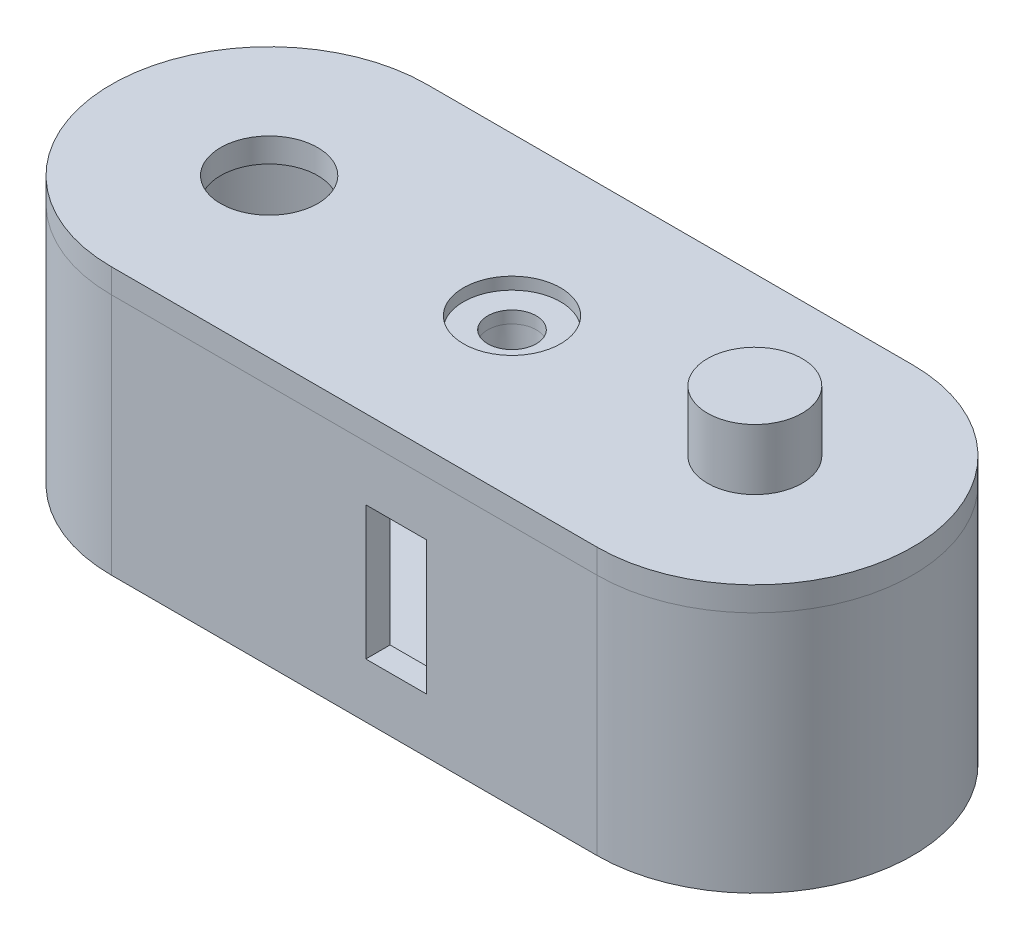
ISO-10303-21;
HEADER;
FILE_DESCRIPTION(('STEP AP214'),'2;1');
FILE_NAME('part.step','',(''),(''),'','','');
FILE_SCHEMA(('AUTOMOTIVE_DESIGN { 1 0 10303 214 1 1 1 1 }'));
ENDSEC;
DATA;
#1=APPLICATION_CONTEXT('core data for automotive mechanical design processes');
#2=APPLICATION_PROTOCOL_DEFINITION('international standard','automotive_design',2000,#1);
#3=PRODUCT_CONTEXT('',#1,'mechanical');
#4=PRODUCT('Part','Part','',(#3));
#5=PRODUCT_RELATED_PRODUCT_CATEGORY('part','',(#4));
#6=PRODUCT_DEFINITION_FORMATION('','',#4);
#7=PRODUCT_DEFINITION_CONTEXT('part definition',#1,'design');
#8=PRODUCT_DEFINITION('design','',#6,#7);
#9=PRODUCT_DEFINITION_SHAPE('','',#8);
#10=(LENGTH_UNIT() NAMED_UNIT(*) SI_UNIT(.MILLI.,.METRE.));
#11=(NAMED_UNIT(*) PLANE_ANGLE_UNIT() SI_UNIT($,.RADIAN.));
#12=(NAMED_UNIT(*) SI_UNIT($,.STERADIAN.) SOLID_ANGLE_UNIT());
#13=UNCERTAINTY_MEASURE_WITH_UNIT(LENGTH_MEASURE(1.E-05),#10,'distance_accuracy_value','');
#14=(GEOMETRIC_REPRESENTATION_CONTEXT(3) GLOBAL_UNCERTAINTY_ASSIGNED_CONTEXT((#13)) GLOBAL_UNIT_ASSIGNED_CONTEXT((#10,
#11,#12)) REPRESENTATION_CONTEXT('',''));
#15=CARTESIAN_POINT('',(0.,0.,0.));
#16=DIRECTION('',(0.,0.,1.));
#17=DIRECTION('',(1.,0.,0.));
#18=AXIS2_PLACEMENT_3D('',#15,#16,#17);
#19=CARTESIAN_POINT('',(20.,20.,0.));
#20=DIRECTION('',(0.,1.,0.));
#21=DIRECTION('',(0.,0.,1.));
#22=AXIS2_PLACEMENT_3D('',#19,#20,#21);
#23=CYLINDRICAL_SURFACE('',#22,2.);
#24=CARTESIAN_POINT('',(20.,20.,0.));
#25=DIRECTION('',(0.,1.,0.));
#26=DIRECTION('',(0.,0.,1.));
#27=AXIS2_PLACEMENT_3D('',#24,#25,#26);
#28=CIRCLE('',#27,2.);
#29=CARTESIAN_POINT('',(20.,20.,2.));
#30=VERTEX_POINT('',#29);
#31=EDGE_CURVE('E127',#30,#30,#28,.T.);
#32=ORIENTED_EDGE('',*,*,#31,.F.);
#33=EDGE_LOOP('',(#32));
#34=FACE_BOUND('',#33,.T.);
#35=CARTESIAN_POINT('',(20.,21.,0.));
#36=DIRECTION('',(0.,1.,0.));
#37=DIRECTION('',(0.,0.,1.));
#38=AXIS2_PLACEMENT_3D('',#35,#36,#37);
#39=CIRCLE('',#38,2.);
#40=CARTESIAN_POINT('',(20.,21.,2.));
#41=VERTEX_POINT('',#40);
#42=EDGE_CURVE('E125',#41,#41,#39,.F.);
#43=ORIENTED_EDGE('',*,*,#42,.F.);
#44=EDGE_LOOP('',(#43));
#45=FACE_BOUND('',#44,.T.);
#46=ADVANCED_FACE('F46',(#34,#45),#23,.F.);
#47=CARTESIAN_POINT('',(0.,22.,0.));
#48=DIRECTION('',(0.,1.,0.));
#49=DIRECTION('',(0.,0.,1.));
#50=AXIS2_PLACEMENT_3D('',#47,#48,#49);
#51=PLANE('',#50);
#52=CARTESIAN_POINT('',(40.0000000000001,22.,0.));
#53=DIRECTION('',(0.,1.,0.));
#54=DIRECTION('',(0.,0.,1.));
#55=AXIS2_PLACEMENT_3D('',#52,#53,#54);
#56=CIRCLE('',#55,3.9);
#57=CARTESIAN_POINT('',(40.0000000000001,22.,3.90000000000009));
#58=VERTEX_POINT('',#57);
#59=EDGE_CURVE('E164',#58,#58,#56,.T.);
#60=ORIENTED_EDGE('',*,*,#59,.F.);
#61=EDGE_LOOP('',(#60));
#62=FACE_BOUND('',#61,.T.);
#63=CARTESIAN_POINT('',(20.,22.,0.));
#64=DIRECTION('',(0.,1.,0.));
#65=DIRECTION('',(0.,0.,1.));
#66=AXIS2_PLACEMENT_3D('',#63,#64,#65);
#67=CIRCLE('',#66,4.);
#68=CARTESIAN_POINT('',(20.,22.,4.));
#69=VERTEX_POINT('',#68);
#70=EDGE_CURVE('E152',#69,#69,#67,.T.);
#71=ORIENTED_EDGE('',*,*,#70,.F.);
#72=EDGE_LOOP('',(#71));
#73=FACE_BOUND('',#72,.T.);
#74=CARTESIAN_POINT('',(0.,22.,0.));
#75=DIRECTION('',(0.,1.,0.));
#76=DIRECTION('',(0.,0.,1.));
#77=AXIS2_PLACEMENT_3D('',#74,#75,#76);
#78=CIRCLE('',#77,12.9999999999999);
#79=CARTESIAN_POINT('',(0.,22.,-12.9999999999999));
#80=VERTEX_POINT('',#79);
#81=CARTESIAN_POINT('',(0.,22.,12.9999999999999));
#82=VERTEX_POINT('',#81);
#83=EDGE_CURVE('E100',#80,#82,#78,.T.);
#84=ORIENTED_EDGE('',*,*,#83,.T.);
#85=DIRECTION('',(1.,0.,0.));
#86=VECTOR('',#85,1.);
#87=CARTESIAN_POINT('',(0.,22.,12.9999999999999));
#88=LINE('',#87,#86);
#89=CARTESIAN_POINT('',(40.0000000000001,22.,13.));
#90=VERTEX_POINT('',#89);
#91=EDGE_CURVE('E94',#82,#90,#88,.T.);
#92=ORIENTED_EDGE('',*,*,#91,.T.);
#93=CARTESIAN_POINT('',(40.0000000000001,22.,0.));
#94=DIRECTION('',(0.,1.,0.));
#95=DIRECTION('',(0.,0.,1.));
#96=AXIS2_PLACEMENT_3D('',#93,#94,#95);
#97=CIRCLE('',#96,12.9999999999999);
#98=CARTESIAN_POINT('',(40.0000000000001,22.,-12.9999999999999));
#99=VERTEX_POINT('',#98);
#100=EDGE_CURVE('E98',#90,#99,#97,.T.);
#101=ORIENTED_EDGE('',*,*,#100,.T.);
#102=DIRECTION('',(-1.,0.,0.));
#103=VECTOR('',#102,1.);
#104=CARTESIAN_POINT('',(0.,22.,-12.9999999999999));
#105=LINE('',#104,#103);
#106=EDGE_CURVE('E63',#99,#80,#105,.T.);
#107=ORIENTED_EDGE('',*,*,#106,.T.);
#108=EDGE_LOOP('',(#84,#92,#101,#107));
#109=FACE_BOUND('',#108,.T.);
#110=CARTESIAN_POINT('',(0.,22.,0.));
#111=DIRECTION('',(0.,1.,0.));
#112=DIRECTION('',(0.,0.,1.));
#113=AXIS2_PLACEMENT_3D('',#110,#111,#112);
#114=CIRCLE('',#113,4.);
#115=CARTESIAN_POINT('',(0.,22.,4.));
#116=VERTEX_POINT('',#115);
#117=EDGE_CURVE('E118',#116,#116,#114,.T.);
#118=ORIENTED_EDGE('',*,*,#117,.F.);
#119=EDGE_LOOP('',(#118));
#120=FACE_BOUND('',#119,.T.);
#121=ADVANCED_FACE('F95',(#62,#73,#109,#120),#51,.T.);
#122=CARTESIAN_POINT('',(0.,20.,0.));
#123=DIRECTION('',(0.,1.,0.));
#124=DIRECTION('',(0.,0.,1.));
#125=AXIS2_PLACEMENT_3D('',#122,#123,#124);
#126=PLANE('',#125);
#127=CARTESIAN_POINT('',(40.0000000000001,20.,0.));
#128=DIRECTION('',(0.,1.,0.));
#129=DIRECTION('',(0.,0.,1.));
#130=AXIS2_PLACEMENT_3D('',#127,#128,#129);
#131=CIRCLE('',#130,10.1725500130529);
#132=CARTESIAN_POINT('',(40.0000000000001,20.,10.1725500130529));
#133=VERTEX_POINT('',#132);
#134=EDGE_CURVE('E55',#133,#133,#131,.F.);
#135=ORIENTED_EDGE('',*,*,#134,.F.);
#136=EDGE_LOOP('',(#135));
#137=FACE_BOUND('',#136,.T.);
#138=ORIENTED_EDGE('',*,*,#31,.T.);
#139=EDGE_LOOP('',(#138));
#140=FACE_BOUND('',#139,.T.);
#141=CARTESIAN_POINT('',(0.,20.,0.));
#142=DIRECTION('',(0.,1.,0.));
#143=DIRECTION('',(0.,0.,1.));
#144=AXIS2_PLACEMENT_3D('',#141,#142,#143);
#145=CIRCLE('',#144,12.9999999999999);
#146=CARTESIAN_POINT('',(0.,20.,-12.9999999999999));
#147=VERTEX_POINT('',#146);
#148=CARTESIAN_POINT('',(0.,20.,12.9999999999999));
#149=VERTEX_POINT('',#148);
#150=EDGE_CURVE('E115',#147,#149,#145,.T.);
#151=ORIENTED_EDGE('',*,*,#150,.F.);
#152=DIRECTION('',(-1.,0.,0.));
#153=VECTOR('',#152,1.);
#154=CARTESIAN_POINT('',(0.,20.,-12.9999999999999));
#155=LINE('',#154,#153);
#156=CARTESIAN_POINT('',(40.0000000000001,20.,-12.9999999999999));
#157=VERTEX_POINT('',#156);
#158=EDGE_CURVE('E86',#157,#147,#155,.T.);
#159=ORIENTED_EDGE('',*,*,#158,.F.);
#160=CARTESIAN_POINT('',(40.0000000000001,20.,0.));
#161=DIRECTION('',(0.,1.,0.));
#162=DIRECTION('',(0.,0.,1.));
#163=AXIS2_PLACEMENT_3D('',#160,#161,#162);
#164=CIRCLE('',#163,12.9999999999999);
#165=CARTESIAN_POINT('',(40.0000000000001,20.,13.));
#166=VERTEX_POINT('',#165);
#167=EDGE_CURVE('E80',#166,#157,#164,.T.);
#168=ORIENTED_EDGE('',*,*,#167,.F.);
#169=DIRECTION('',(1.,0.,0.));
#170=VECTOR('',#169,1.);
#171=CARTESIAN_POINT('',(0.,20.,12.9999999999999));
#172=LINE('',#171,#170);
#173=EDGE_CURVE('E105',#149,#166,#172,.T.);
#174=ORIENTED_EDGE('',*,*,#173,.F.);
#175=EDGE_LOOP('',(#151,#159,#168,#174));
#176=FACE_BOUND('',#175,.T.);
#177=CARTESIAN_POINT('',(0.,20.,0.));
#178=DIRECTION('',(0.,1.,0.));
#179=DIRECTION('',(0.,0.,1.));
#180=AXIS2_PLACEMENT_3D('',#177,#178,#179);
#181=CIRCLE('',#180,4.);
#182=CARTESIAN_POINT('',(0.,20.,4.));
#183=VERTEX_POINT('',#182);
#184=EDGE_CURVE('E145',#183,#183,#181,.T.);
#185=ORIENTED_EDGE('',*,*,#184,.T.);
#186=EDGE_LOOP('',(#185));
#187=FACE_BOUND('',#186,.T.);
#188=ADVANCED_FACE('F134',(#137,#140,#176,#187),#126,.F.);
#189=CARTESIAN_POINT('',(0.,22.,0.));
#190=DIRECTION('',(0.,-1.,0.));
#191=DIRECTION('',(0.,0.,-1.));
#192=AXIS2_PLACEMENT_3D('',#189,#190,#191);
#193=CYLINDRICAL_SURFACE('',#192,12.9999999999999);
#194=ORIENTED_EDGE('',*,*,#150,.T.);
#195=DIRECTION('',(0.,-1.,0.));
#196=VECTOR('',#195,1.);
#197=CARTESIAN_POINT('',(0.,22.,12.9999999999999));
#198=LINE('',#197,#196);
#199=EDGE_CURVE('E106',#82,#149,#198,.T.);
#200=ORIENTED_EDGE('',*,*,#199,.F.);
#201=ORIENTED_EDGE('',*,*,#83,.F.);
#202=DIRECTION('',(0.,-1.,0.));
#203=VECTOR('',#202,1.);
#204=CARTESIAN_POINT('',(0.,22.,-12.9999999999999));
#205=LINE('',#204,#203);
#206=EDGE_CURVE('E111',#80,#147,#205,.T.);
#207=ORIENTED_EDGE('',*,*,#206,.T.);
#208=EDGE_LOOP('',(#194,#200,#201,#207));
#209=FACE_BOUND('',#208,.T.);
#210=ADVANCED_FACE('F48',(#209),#193,.T.);
#211=CARTESIAN_POINT('',(0.,22.,12.9999999999999));
#212=DIRECTION('',(0.,0.,-1.));
#213=DIRECTION('',(-1.,0.,0.));
#214=AXIS2_PLACEMENT_3D('',#211,#212,#213);
#215=PLANE('',#214);
#216=ORIENTED_EDGE('',*,*,#173,.T.);
#217=DIRECTION('',(0.,-1.,0.));
#218=VECTOR('',#217,1.);
#219=CARTESIAN_POINT('',(40.0000000000001,22.,13.));
#220=LINE('',#219,#218);
#221=EDGE_CURVE('E103',#90,#166,#220,.T.);
#222=ORIENTED_EDGE('',*,*,#221,.F.);
#223=ORIENTED_EDGE('',*,*,#91,.F.);
#224=ORIENTED_EDGE('',*,*,#199,.T.);
#225=EDGE_LOOP('',(#216,#222,#223,#224));
#226=FACE_BOUND('',#225,.T.);
#227=ADVANCED_FACE('F104',(#226),#215,.F.);
#228=CARTESIAN_POINT('',(40.0000000000001,22.,0.));
#229=DIRECTION('',(0.,-1.,0.));
#230=DIRECTION('',(0.,0.,-1.));
#231=AXIS2_PLACEMENT_3D('',#228,#229,#230);
#232=CYLINDRICAL_SURFACE('',#231,12.9999999999999);
#233=ORIENTED_EDGE('',*,*,#167,.T.);
#234=DIRECTION('',(0.,-1.,0.));
#235=VECTOR('',#234,1.);
#236=CARTESIAN_POINT('',(40.0000000000001,22.,-12.9999999999999));
#237=LINE('',#236,#235);
#238=EDGE_CURVE('E107',#99,#157,#237,.T.);
#239=ORIENTED_EDGE('',*,*,#238,.F.);
#240=ORIENTED_EDGE('',*,*,#100,.F.);
#241=ORIENTED_EDGE('',*,*,#221,.T.);
#242=EDGE_LOOP('',(#233,#239,#240,#241));
#243=FACE_BOUND('',#242,.T.);
#244=ADVANCED_FACE('F109',(#243),#232,.T.);
#245=CARTESIAN_POINT('',(0.,22.,-12.9999999999999));
#246=DIRECTION('',(0.,0.,1.));
#247=DIRECTION('',(1.,0.,0.));
#248=AXIS2_PLACEMENT_3D('',#245,#246,#247);
#249=PLANE('',#248);
#250=ORIENTED_EDGE('',*,*,#158,.T.);
#251=ORIENTED_EDGE('',*,*,#206,.F.);
#252=ORIENTED_EDGE('',*,*,#106,.F.);
#253=ORIENTED_EDGE('',*,*,#238,.T.);
#254=EDGE_LOOP('',(#250,#251,#252,#253));
#255=FACE_BOUND('',#254,.T.);
#256=ADVANCED_FACE('F208',(#255),#249,.F.);
#257=CARTESIAN_POINT('',(0.,22.,0.));
#258=DIRECTION('',(0.,-1.,0.));
#259=DIRECTION('',(0.,0.,-1.));
#260=AXIS2_PLACEMENT_3D('',#257,#258,#259);
#261=CYLINDRICAL_SURFACE('',#260,4.);
#262=ORIENTED_EDGE('',*,*,#117,.T.);
#263=EDGE_LOOP('',(#262));
#264=FACE_BOUND('',#263,.T.);
#265=ORIENTED_EDGE('',*,*,#184,.F.);
#266=EDGE_LOOP('',(#265));
#267=FACE_BOUND('',#266,.T.);
#268=ADVANCED_FACE('F196',(#264,#267),#261,.F.);
#269=CARTESIAN_POINT('',(20.,21.,0.));
#270=DIRECTION('',(0.,1.,0.));
#271=DIRECTION('',(0.,0.,1.));
#272=AXIS2_PLACEMENT_3D('',#269,#270,#271);
#273=PLANE('',#272);
#274=CARTESIAN_POINT('',(20.,21.,0.));
#275=DIRECTION('',(0.,1.,0.));
#276=DIRECTION('',(0.,0.,1.));
#277=AXIS2_PLACEMENT_3D('',#274,#275,#276);
#278=CIRCLE('',#277,4.);
#279=CARTESIAN_POINT('',(20.,21.,4.));
#280=VERTEX_POINT('',#279);
#281=EDGE_CURVE('E128',#280,#280,#278,.T.);
#282=ORIENTED_EDGE('',*,*,#281,.T.);
#283=EDGE_LOOP('',(#282));
#284=FACE_BOUND('',#283,.T.);
#285=ORIENTED_EDGE('',*,*,#42,.T.);
#286=EDGE_LOOP('',(#285));
#287=FACE_BOUND('',#286,.T.);
#288=ADVANCED_FACE('F187',(#284,#287),#273,.T.);
#289=CARTESIAN_POINT('',(20.,21.,0.));
#290=DIRECTION('',(0.,1.,0.));
#291=DIRECTION('',(0.,0.,1.));
#292=AXIS2_PLACEMENT_3D('',#289,#290,#291);
#293=CYLINDRICAL_SURFACE('',#292,4.);
#294=ORIENTED_EDGE('',*,*,#281,.F.);
#295=EDGE_LOOP('',(#294));
#296=FACE_BOUND('',#295,.T.);
#297=ORIENTED_EDGE('',*,*,#70,.T.);
#298=EDGE_LOOP('',(#297));
#299=FACE_BOUND('',#298,.T.);
#300=ADVANCED_FACE('F184',(#296,#299),#293,.F.);
#301=CARTESIAN_POINT('',(40.0000000000001,13.,0.));
#302=DIRECTION('',(0.,-1.,0.));
#303=DIRECTION('',(0.,0.,-1.));
#304=AXIS2_PLACEMENT_3D('',#301,#302,#303);
#305=PLANE('',#304);
#306=CARTESIAN_POINT('',(40.0000000000001,13.,0.));
#307=DIRECTION('',(0.,-1.,0.));
#308=DIRECTION('',(0.,0.,-1.));
#309=AXIS2_PLACEMENT_3D('',#306,#307,#308);
#310=CIRCLE('',#309,10.1725500130529);
#311=CARTESIAN_POINT('',(40.0000000000001,13.,-10.1725500130528));
#312=VERTEX_POINT('',#311);
#313=EDGE_CURVE('E155',#312,#312,#310,.T.);
#314=ORIENTED_EDGE('',*,*,#313,.T.);
#315=EDGE_LOOP('',(#314));
#316=FACE_BOUND('',#315,.T.);
#317=CARTESIAN_POINT('',(40.0000000000001,13.,0.));
#318=DIRECTION('',(0.,-1.,0.));
#319=DIRECTION('',(0.,0.,-1.));
#320=AXIS2_PLACEMENT_3D('',#317,#318,#319);
#321=CIRCLE('',#320,8.79078221641569);
#322=CARTESIAN_POINT('',(40.0000000000001,13.,-8.7907822164156));
#323=VERTEX_POINT('',#322);
#324=EDGE_CURVE('E160',#323,#323,#321,.T.);
#325=ORIENTED_EDGE('',*,*,#324,.F.);
#326=EDGE_LOOP('',(#325));
#327=FACE_BOUND('',#326,.T.);
#328=ADVANCED_FACE('F186',(#316,#327),#305,.T.);
#329=CARTESIAN_POINT('',(40.0000000000001,13.,0.));
#330=DIRECTION('',(0.,1.,0.));
#331=DIRECTION('',(0.,0.,1.));
#332=AXIS2_PLACEMENT_3D('',#329,#330,#331);
#333=CYLINDRICAL_SURFACE('',#332,10.1725500130529);
#334=ORIENTED_EDGE('',*,*,#313,.F.);
#335=EDGE_LOOP('',(#334));
#336=FACE_BOUND('',#335,.T.);
#337=ORIENTED_EDGE('',*,*,#134,.T.);
#338=EDGE_LOOP('',(#337));
#339=FACE_BOUND('',#338,.T.);
#340=ADVANCED_FACE('F132',(#336,#339),#333,.T.);
#341=CARTESIAN_POINT('',(40.0000000000001,13.,0.));
#342=DIRECTION('',(0.,1.,0.));
#343=DIRECTION('',(0.,0.,1.));
#344=AXIS2_PLACEMENT_3D('',#341,#342,#343);
#345=CYLINDRICAL_SURFACE('',#344,8.79078221641569);
#346=CARTESIAN_POINT('',(40.0000000000001,16.,0.));
#347=DIRECTION('',(0.,-1.,0.));
#348=DIRECTION('',(0.,0.,-1.));
#349=AXIS2_PLACEMENT_3D('',#346,#347,#348);
#350=CIRCLE('',#349,8.79078221641569);
#351=CARTESIAN_POINT('',(40.0000000000001,16.,-8.7907822164156));
#352=VERTEX_POINT('',#351);
#353=EDGE_CURVE('E12',#352,#352,#350,.T.);
#354=ORIENTED_EDGE('',*,*,#353,.F.);
#355=EDGE_LOOP('',(#354));
#356=FACE_BOUND('',#355,.T.);
#357=ORIENTED_EDGE('',*,*,#324,.T.);
#358=EDGE_LOOP('',(#357));
#359=FACE_BOUND('',#358,.T.);
#360=ADVANCED_FACE('F255',(#356,#359),#345,.F.);
#361=CARTESIAN_POINT('',(40.0000000000001,16.,0.));
#362=DIRECTION('',(0.,-1.,0.));
#363=DIRECTION('',(0.,0.,-1.));
#364=AXIS2_PLACEMENT_3D('',#361,#362,#363);
#365=PLANE('',#364);
#366=ORIENTED_EDGE('',*,*,#353,.T.);
#367=EDGE_LOOP('',(#366));
#368=FACE_BOUND('',#367,.T.);
#369=ADVANCED_FACE('F175',(#368),#365,.T.);
#370=CARTESIAN_POINT('',(40.0000000000001,27.,0.));
#371=DIRECTION('',(0.,-1.,0.));
#372=DIRECTION('',(0.,0.,-1.));
#373=AXIS2_PLACEMENT_3D('',#370,#371,#372);
#374=CYLINDRICAL_SURFACE('',#373,3.9);
#375=CARTESIAN_POINT('',(40.0000000000001,27.,0.));
#376=DIRECTION('',(0.,1.,0.));
#377=DIRECTION('',(0.,0.,1.));
#378=AXIS2_PLACEMENT_3D('',#375,#376,#377);
#379=CIRCLE('',#378,3.9);
#380=CARTESIAN_POINT('',(40.0000000000001,27.,3.90000000000009));
#381=VERTEX_POINT('',#380);
#382=EDGE_CURVE('E163',#381,#381,#379,.T.);
#383=ORIENTED_EDGE('',*,*,#382,.F.);
#384=EDGE_LOOP('',(#383));
#385=FACE_BOUND('',#384,.T.);
#386=ORIENTED_EDGE('',*,*,#59,.T.);
#387=EDGE_LOOP('',(#386));
#388=FACE_BOUND('',#387,.T.);
#389=ADVANCED_FACE('F172',(#385,#388),#374,.T.);
#390=CARTESIAN_POINT('',(40.0000000000001,27.,0.));
#391=DIRECTION('',(0.,1.,0.));
#392=DIRECTION('',(0.,0.,1.));
#393=AXIS2_PLACEMENT_3D('',#390,#391,#392);
#394=PLANE('',#393);
#395=ORIENTED_EDGE('',*,*,#382,.T.);
#396=EDGE_LOOP('',(#395));
#397=FACE_BOUND('',#396,.T.);
#398=ADVANCED_FACE('F170',(#397),#394,.T.);
#399=CLOSED_SHELL('',(#46,#121,#188,#210,#227,#244,#256,#268,#288,#300,#328,#340,#360,#369,#389,#398));
#400=MANIFOLD_SOLID_BREP('B2',#399);
#401=CARTESIAN_POINT('',(0.,20.,0.));
#402=DIRECTION('',(0.,-1.,0.));
#403=DIRECTION('',(0.,0.,-1.));
#404=AXIS2_PLACEMENT_3D('',#401,#402,#403);
#405=CYLINDRICAL_SURFACE('',#404,11.);
#406=CARTESIAN_POINT('',(0.,8.,0.));
#407=DIRECTION('',(0.,1.,0.));
#408=DIRECTION('',(0.,0.,1.));
#409=AXIS2_PLACEMENT_3D('',#406,#407,#408);
#410=CIRCLE('',#409,11.);
#411=CARTESIAN_POINT('',(0.,8.,-11.));
#412=VERTEX_POINT('',#411);
#413=CARTESIAN_POINT('',(0.,8.,11.));
#414=VERTEX_POINT('',#413);
#415=EDGE_CURVE('E541',#412,#414,#410,.T.);
#416=ORIENTED_EDGE('',*,*,#415,.F.);
#417=DIRECTION('',(0.,-1.,0.));
#418=VECTOR('',#417,1.);
#419=CARTESIAN_POINT('',(0.,20.,-11.));
#420=LINE('',#419,#418);
#421=CARTESIAN_POINT('',(0.,20.,-11.));
#422=VERTEX_POINT('',#421);
#423=EDGE_CURVE('E572',#422,#412,#420,.T.);
#424=ORIENTED_EDGE('',*,*,#423,.F.);
#425=CARTESIAN_POINT('',(0.,20.,0.));
#426=DIRECTION('',(0.,1.,0.));
#427=DIRECTION('',(0.,0.,1.));
#428=AXIS2_PLACEMENT_3D('',#425,#426,#427);
#429=CIRCLE('',#428,11.);
#430=CARTESIAN_POINT('',(0.,20.,11.));
#431=VERTEX_POINT('',#430);
#432=EDGE_CURVE('E563',#422,#431,#429,.T.);
#433=ORIENTED_EDGE('',*,*,#432,.T.);
#434=DIRECTION('',(0.,-1.,0.));
#435=VECTOR('',#434,1.);
#436=CARTESIAN_POINT('',(0.,20.,11.));
#437=LINE('',#436,#435);
#438=EDGE_CURVE('E581',#431,#414,#437,.T.);
#439=ORIENTED_EDGE('',*,*,#438,.T.);
#440=EDGE_LOOP('',(#416,#424,#433,#439));
#441=FACE_BOUND('',#440,.T.);
#442=ADVANCED_FACE('F331',(#441),#405,.F.);
#443=CARTESIAN_POINT('',(0.,20.,11.));
#444=DIRECTION('',(0.,0.,-1.));
#445=DIRECTION('',(-1.,0.,0.));
#446=AXIS2_PLACEMENT_3D('',#443,#444,#445);
#447=PLANE('',#446);
#448=DIRECTION('',(-1.,0.,0.));
#449=VECTOR('',#448,1.);
#450=CARTESIAN_POINT('',(25.95994674273,15.5,11.));
#451=LINE('',#450,#449);
#452=CARTESIAN_POINT('',(25.95994674273,15.5,11.));
#453=VERTEX_POINT('',#452);
#454=CARTESIAN_POINT('',(20.95994674273,15.5,11.));
#455=VERTEX_POINT('',#454);
#456=EDGE_CURVE('E487',#453,#455,#451,.T.);
#457=ORIENTED_EDGE('',*,*,#456,.T.);
#458=DIRECTION('',(0.,-1.,0.));
#459=VECTOR('',#458,1.);
#460=CARTESIAN_POINT('',(20.95994674273,15.5,11.));
#461=LINE('',#460,#459);
#462=CARTESIAN_POINT('',(20.95994674273,4.5,11.));
#463=VERTEX_POINT('',#462);
#464=EDGE_CURVE('E490',#455,#463,#461,.T.);
#465=ORIENTED_EDGE('',*,*,#464,.T.);
#466=DIRECTION('',(1.,0.,0.));
#467=VECTOR('',#466,1.);
#468=CARTESIAN_POINT('',(25.95994674273,4.5,11.));
#469=LINE('',#468,#467);
#470=CARTESIAN_POINT('',(25.95994674273,4.5,11.));
#471=VERTEX_POINT('',#470);
#472=EDGE_CURVE('E494',#463,#471,#469,.T.);
#473=ORIENTED_EDGE('',*,*,#472,.T.);
#474=DIRECTION('',(0.,1.,0.));
#475=VECTOR('',#474,1.);
#476=CARTESIAN_POINT('',(25.95994674273,15.5,11.));
#477=LINE('',#476,#475);
#478=EDGE_CURVE('E497',#471,#453,#477,.T.);
#479=ORIENTED_EDGE('',*,*,#478,.T.);
#480=EDGE_LOOP('',(#457,#465,#473,#479));
#481=FACE_BOUND('',#480,.T.);
#482=DIRECTION('',(0.,-1.,0.));
#483=VECTOR('',#482,1.);
#484=CARTESIAN_POINT('',(40.,20.,11.));
#485=LINE('',#484,#483);
#486=CARTESIAN_POINT('',(40.,20.,11.));
#487=VERTEX_POINT('',#486);
#488=CARTESIAN_POINT('',(40.0000000000001,4.,11.));
#489=VERTEX_POINT('',#488);
#490=EDGE_CURVE('E578',#487,#489,#485,.T.);
#491=ORIENTED_EDGE('',*,*,#490,.T.);
#492=DIRECTION('',(-1.,0.,0.));
#493=VECTOR('',#492,1.);
#494=CARTESIAN_POINT('',(20.,4.,11.));
#495=LINE('',#494,#493);
#496=CARTESIAN_POINT('',(0.,4.,11.));
#497=VERTEX_POINT('',#496);
#498=EDGE_CURVE('E557',#489,#497,#495,.T.);
#499=ORIENTED_EDGE('',*,*,#498,.T.);
#500=DIRECTION('',(0.,-1.,0.));
#501=VECTOR('',#500,1.);
#502=CARTESIAN_POINT('',(0.,8.,11.));
#503=LINE('',#502,#501);
#504=EDGE_CURVE('E546',#497,#414,#503,.F.);
#505=ORIENTED_EDGE('',*,*,#504,.T.);
#506=ORIENTED_EDGE('',*,*,#438,.F.);
#507=DIRECTION('',(1.,0.,0.));
#508=VECTOR('',#507,1.);
#509=CARTESIAN_POINT('',(0.,20.,11.));
#510=LINE('',#509,#508);
#511=EDGE_CURVE('E565',#431,#487,#510,.T.);
#512=ORIENTED_EDGE('',*,*,#511,.T.);
#513=EDGE_LOOP('',(#491,#499,#505,#506,#512));
#514=FACE_BOUND('',#513,.T.);
#515=ADVANCED_FACE('F652',(#481,#514),#447,.T.);
#516=CARTESIAN_POINT('',(40.,20.,0.));
#517=DIRECTION('',(0.,-1.,0.));
#518=DIRECTION('',(0.,0.,-1.));
#519=AXIS2_PLACEMENT_3D('',#516,#517,#518);
#520=CYLINDRICAL_SURFACE('',#519,11.);
#521=DIRECTION('',(0.,-1.,0.));
#522=VECTOR('',#521,1.);
#523=CARTESIAN_POINT('',(40.,20.,-11.));
#524=LINE('',#523,#522);
#525=CARTESIAN_POINT('',(40.,20.,-11.));
#526=VERTEX_POINT('',#525);
#527=CARTESIAN_POINT('',(40.,4.,-11.));
#528=VERTEX_POINT('',#527);
#529=EDGE_CURVE('E575',#526,#528,#524,.T.);
#530=ORIENTED_EDGE('',*,*,#529,.T.);
#531=CARTESIAN_POINT('',(40.0000000000001,4.,0.));
#532=DIRECTION('',(0.,-1.,0.));
#533=DIRECTION('',(0.,0.,-1.));
#534=AXIS2_PLACEMENT_3D('',#531,#532,#533);
#535=CIRCLE('',#534,11.);
#536=EDGE_CURVE('E552',#528,#489,#535,.T.);
#537=ORIENTED_EDGE('',*,*,#536,.T.);
#538=ORIENTED_EDGE('',*,*,#490,.F.);
#539=CARTESIAN_POINT('',(40.,20.,0.));
#540=DIRECTION('',(0.,1.,0.));
#541=DIRECTION('',(0.,0.,1.));
#542=AXIS2_PLACEMENT_3D('',#539,#540,#541);
#543=CIRCLE('',#542,11.);
#544=EDGE_CURVE('E567',#487,#526,#543,.T.);
#545=ORIENTED_EDGE('',*,*,#544,.T.);
#546=EDGE_LOOP('',(#530,#537,#538,#545));
#547=FACE_BOUND('',#546,.T.);
#548=ADVANCED_FACE('F658',(#547),#520,.F.);
#549=CARTESIAN_POINT('',(0.,20.,-11.));
#550=DIRECTION('',(0.,0.,1.));
#551=DIRECTION('',(1.,0.,0.));
#552=AXIS2_PLACEMENT_3D('',#549,#550,#551);
#553=PLANE('',#552);
#554=DIRECTION('',(0.,-1.,0.));
#555=VECTOR('',#554,1.);
#556=CARTESIAN_POINT('',(25.95994674273,15.5,-11.));
#557=LINE('',#556,#555);
#558=CARTESIAN_POINT('',(25.95994674273,15.5,-11.));
#559=VERTEX_POINT('',#558);
#560=CARTESIAN_POINT('',(25.95994674273,4.5,-11.));
#561=VERTEX_POINT('',#560);
#562=EDGE_CURVE('E452',#559,#561,#557,.T.);
#563=ORIENTED_EDGE('',*,*,#562,.T.);
#564=DIRECTION('',(-1.,0.,0.));
#565=VECTOR('',#564,1.);
#566=CARTESIAN_POINT('',(25.95994674273,4.5,-11.));
#567=LINE('',#566,#565);
#568=CARTESIAN_POINT('',(20.95994674273,4.5,-11.));
#569=VERTEX_POINT('',#568);
#570=EDGE_CURVE('E461',#561,#569,#567,.T.);
#571=ORIENTED_EDGE('',*,*,#570,.T.);
#572=DIRECTION('',(0.,1.,0.));
#573=VECTOR('',#572,1.);
#574=CARTESIAN_POINT('',(20.95994674273,15.5,-11.));
#575=LINE('',#574,#573);
#576=CARTESIAN_POINT('',(20.95994674273,15.5,-11.));
#577=VERTEX_POINT('',#576);
#578=EDGE_CURVE('E346',#569,#577,#575,.T.);
#579=ORIENTED_EDGE('',*,*,#578,.T.);
#580=DIRECTION('',(1.,0.,0.));
#581=VECTOR('',#580,1.);
#582=CARTESIAN_POINT('',(25.95994674273,15.5,-11.));
#583=LINE('',#582,#581);
#584=EDGE_CURVE('E458',#577,#559,#583,.T.);
#585=ORIENTED_EDGE('',*,*,#584,.T.);
#586=EDGE_LOOP('',(#563,#571,#579,#585));
#587=FACE_BOUND('',#586,.T.);
#588=ORIENTED_EDGE('',*,*,#423,.T.);
#589=DIRECTION('',(0.,-1.,0.));
#590=VECTOR('',#589,1.);
#591=CARTESIAN_POINT('',(0.,8.,-11.));
#592=LINE('',#591,#590);
#593=CARTESIAN_POINT('',(0.,4.,-11.));
#594=VERTEX_POINT('',#593);
#595=EDGE_CURVE('E540',#594,#412,#592,.F.);
#596=ORIENTED_EDGE('',*,*,#595,.F.);
#597=DIRECTION('',(1.,0.,0.));
#598=VECTOR('',#597,1.);
#599=CARTESIAN_POINT('',(20.,4.,-11.));
#600=LINE('',#599,#598);
#601=EDGE_CURVE('E560',#594,#528,#600,.T.);
#602=ORIENTED_EDGE('',*,*,#601,.T.);
#603=ORIENTED_EDGE('',*,*,#529,.F.);
#604=DIRECTION('',(-1.,0.,0.));
#605=VECTOR('',#604,1.);
#606=CARTESIAN_POINT('',(0.,20.,-11.));
#607=LINE('',#606,#605);
#608=EDGE_CURVE('E570',#526,#422,#607,.T.);
#609=ORIENTED_EDGE('',*,*,#608,.T.);
#610=EDGE_LOOP('',(#588,#596,#602,#603,#609));
#611=FACE_BOUND('',#610,.T.);
#612=ADVANCED_FACE('F465',(#587,#611),#553,.T.);
#613=CARTESIAN_POINT('',(0.,20.,0.));
#614=DIRECTION('',(0.,1.,0.));
#615=DIRECTION('',(0.,0.,1.));
#616=AXIS2_PLACEMENT_3D('',#613,#614,#615);
#617=PLANE('',#616);
#618=CARTESIAN_POINT('',(0.,20.,0.));
#619=DIRECTION('',(0.,1.,0.));
#620=DIRECTION('',(0.,0.,1.));
#621=AXIS2_PLACEMENT_3D('',#618,#619,#620);
#622=CIRCLE('',#621,13.);
#623=CARTESIAN_POINT('',(0.,20.,-13.));
#624=VERTEX_POINT('',#623);
#625=CARTESIAN_POINT('',(0.,20.,13.));
#626=VERTEX_POINT('',#625);
#627=EDGE_CURVE('E585',#624,#626,#622,.T.);
#628=ORIENTED_EDGE('',*,*,#627,.T.);
#629=DIRECTION('',(1.,0.,0.));
#630=VECTOR('',#629,1.);
#631=CARTESIAN_POINT('',(0.,20.,13.));
#632=LINE('',#631,#630);
#633=CARTESIAN_POINT('',(40.,20.,13.));
#634=VERTEX_POINT('',#633);
#635=EDGE_CURVE('E588',#626,#634,#632,.T.);
#636=ORIENTED_EDGE('',*,*,#635,.T.);
#637=CARTESIAN_POINT('',(40.,20.,0.));
#638=DIRECTION('',(0.,1.,0.));
#639=DIRECTION('',(0.,0.,1.));
#640=AXIS2_PLACEMENT_3D('',#637,#638,#639);
#641=CIRCLE('',#640,13.);
#642=CARTESIAN_POINT('',(40.,20.,-13.));
#643=VERTEX_POINT('',#642);
#644=EDGE_CURVE('E591',#634,#643,#641,.T.);
#645=ORIENTED_EDGE('',*,*,#644,.T.);
#646=DIRECTION('',(-1.,0.,0.));
#647=VECTOR('',#646,1.);
#648=CARTESIAN_POINT('',(0.,20.,-13.));
#649=LINE('',#648,#647);
#650=EDGE_CURVE('E593',#643,#624,#649,.T.);
#651=ORIENTED_EDGE('',*,*,#650,.T.);
#652=EDGE_LOOP('',(#628,#636,#645,#651));
#653=FACE_BOUND('',#652,.T.);
#654=ORIENTED_EDGE('',*,*,#511,.F.);
#655=ORIENTED_EDGE('',*,*,#432,.F.);
#656=ORIENTED_EDGE('',*,*,#608,.F.);
#657=ORIENTED_EDGE('',*,*,#544,.F.);
#658=EDGE_LOOP('',(#654,#655,#656,#657));
#659=FACE_BOUND('',#658,.T.);
#660=ADVANCED_FACE('F637',(#653,#659),#617,.T.);
#661=CARTESIAN_POINT('',(0.,0.,0.));
#662=DIRECTION('',(0.,1.,0.));
#663=DIRECTION('',(0.,0.,1.));
#664=AXIS2_PLACEMENT_3D('',#661,#662,#663);
#665=PLANE('',#664);
#666=CARTESIAN_POINT('',(0.,0.,0.));
#667=DIRECTION('',(0.,1.,0.));
#668=DIRECTION('',(0.,0.,1.));
#669=AXIS2_PLACEMENT_3D('',#666,#667,#668);
#670=CIRCLE('',#669,3.9);
#671=CARTESIAN_POINT('',(0.,0.,3.9));
#672=VERTEX_POINT('',#671);
#673=EDGE_CURVE('E44',#672,#672,#670,.F.);
#674=ORIENTED_EDGE('',*,*,#673,.F.);
#675=EDGE_LOOP('',(#674));
#676=FACE_BOUND('',#675,.T.);
#677=CARTESIAN_POINT('',(0.,0.,0.));
#678=DIRECTION('',(0.,1.,0.));
#679=DIRECTION('',(0.,0.,1.));
#680=AXIS2_PLACEMENT_3D('',#677,#678,#679);
#681=CIRCLE('',#680,13.);
#682=CARTESIAN_POINT('',(0.,0.,-13.));
#683=VERTEX_POINT('',#682);
#684=CARTESIAN_POINT('',(0.,0.,13.));
#685=VERTEX_POINT('',#684);
#686=EDGE_CURVE('E584',#683,#685,#681,.T.);
#687=ORIENTED_EDGE('',*,*,#686,.F.);
#688=DIRECTION('',(-1.,0.,0.));
#689=VECTOR('',#688,1.);
#690=CARTESIAN_POINT('',(0.,0.,-13.));
#691=LINE('',#690,#689);
#692=CARTESIAN_POINT('',(40.,0.,-13.));
#693=VERTEX_POINT('',#692);
#694=EDGE_CURVE('E589',#693,#683,#691,.T.);
#695=ORIENTED_EDGE('',*,*,#694,.F.);
#696=CARTESIAN_POINT('',(40.,0.,0.));
#697=DIRECTION('',(0.,1.,0.));
#698=DIRECTION('',(0.,0.,1.));
#699=AXIS2_PLACEMENT_3D('',#696,#697,#698);
#700=CIRCLE('',#699,13.);
#701=CARTESIAN_POINT('',(40.,0.,13.));
#702=VERTEX_POINT('',#701);
#703=EDGE_CURVE('E600',#702,#693,#700,.T.);
#704=ORIENTED_EDGE('',*,*,#703,.F.);
#705=DIRECTION('',(1.,0.,0.));
#706=VECTOR('',#705,1.);
#707=CARTESIAN_POINT('',(0.,0.,13.));
#708=LINE('',#707,#706);
#709=EDGE_CURVE('E598',#685,#702,#708,.T.);
#710=ORIENTED_EDGE('',*,*,#709,.F.);
#711=EDGE_LOOP('',(#687,#695,#704,#710));
#712=FACE_BOUND('',#711,.T.);
#713=CARTESIAN_POINT('',(40.0000000000001,0.,0.));
#714=DIRECTION('',(0.,-1.,0.));
#715=DIRECTION('',(0.,0.,-1.));
#716=AXIS2_PLACEMENT_3D('',#713,#714,#715);
#717=CIRCLE('',#716,4.00000000000001);
#718=CARTESIAN_POINT('',(40.0000000000001,0.,-3.99999999999992));
#719=VERTEX_POINT('',#718);
#720=EDGE_CURVE('E548',#719,#719,#717,.T.);
#721=ORIENTED_EDGE('',*,*,#720,.F.);
#722=EDGE_LOOP('',(#721));
#723=FACE_BOUND('',#722,.T.);
#724=ADVANCED_FACE('F635',(#676,#712,#723),#665,.F.);
#725=CARTESIAN_POINT('',(0.,20.,0.));
#726=DIRECTION('',(0.,-1.,0.));
#727=DIRECTION('',(0.,0.,-1.));
#728=AXIS2_PLACEMENT_3D('',#725,#726,#727);
#729=CYLINDRICAL_SURFACE('',#728,13.);
#730=ORIENTED_EDGE('',*,*,#686,.T.);
#731=DIRECTION('',(0.,-1.,0.));
#732=VECTOR('',#731,1.);
#733=CARTESIAN_POINT('',(0.,20.,13.));
#734=LINE('',#733,#732);
#735=EDGE_CURVE('E611',#626,#685,#734,.T.);
#736=ORIENTED_EDGE('',*,*,#735,.F.);
#737=ORIENTED_EDGE('',*,*,#627,.F.);
#738=DIRECTION('',(0.,-1.,0.));
#739=VECTOR('',#738,1.);
#740=CARTESIAN_POINT('',(0.,20.,-13.));
#741=LINE('',#740,#739);
#742=EDGE_CURVE('E595',#624,#683,#741,.T.);
#743=ORIENTED_EDGE('',*,*,#742,.T.);
#744=EDGE_LOOP('',(#730,#736,#737,#743));
#745=FACE_BOUND('',#744,.T.);
#746=ADVANCED_FACE('F333',(#745),#729,.T.);
#747=CARTESIAN_POINT('',(0.,20.,13.));
#748=DIRECTION('',(0.,0.,-1.));
#749=DIRECTION('',(-1.,0.,0.));
#750=AXIS2_PLACEMENT_3D('',#747,#748,#749);
#751=PLANE('',#750);
#752=DIRECTION('',(0.,-1.,0.));
#753=VECTOR('',#752,1.);
#754=CARTESIAN_POINT('',(20.95994674273,15.5,13.));
#755=LINE('',#754,#753);
#756=CARTESIAN_POINT('',(20.95994674273,15.5,13.));
#757=VERTEX_POINT('',#756);
#758=CARTESIAN_POINT('',(20.95994674273,4.5,13.));
#759=VERTEX_POINT('',#758);
#760=EDGE_CURVE('E502',#757,#759,#755,.T.);
#761=ORIENTED_EDGE('',*,*,#760,.F.);
#762=DIRECTION('',(-1.,0.,0.));
#763=VECTOR('',#762,1.);
#764=CARTESIAN_POINT('',(25.95994674273,15.5,13.));
#765=LINE('',#764,#763);
#766=CARTESIAN_POINT('',(25.95994674273,15.5,13.));
#767=VERTEX_POINT('',#766);
#768=EDGE_CURVE('E483',#767,#757,#765,.T.);
#769=ORIENTED_EDGE('',*,*,#768,.F.);
#770=DIRECTION('',(0.,1.,0.));
#771=VECTOR('',#770,1.);
#772=CARTESIAN_POINT('',(25.95994674273,15.5,13.));
#773=LINE('',#772,#771);
#774=CARTESIAN_POINT('',(25.95994674273,4.5,13.));
#775=VERTEX_POINT('',#774);
#776=EDGE_CURVE('E491',#775,#767,#773,.T.);
#777=ORIENTED_EDGE('',*,*,#776,.F.);
#778=DIRECTION('',(1.,0.,0.));
#779=VECTOR('',#778,1.);
#780=CARTESIAN_POINT('',(25.95994674273,4.5,13.));
#781=LINE('',#780,#779);
#782=EDGE_CURVE('E505',#759,#775,#781,.T.);
#783=ORIENTED_EDGE('',*,*,#782,.F.);
#784=EDGE_LOOP('',(#761,#769,#777,#783));
#785=FACE_BOUND('',#784,.T.);
#786=ORIENTED_EDGE('',*,*,#709,.T.);
#787=DIRECTION('',(0.,-1.,0.));
#788=VECTOR('',#787,1.);
#789=CARTESIAN_POINT('',(40.,20.,13.));
#790=LINE('',#789,#788);
#791=EDGE_CURVE('E608',#634,#702,#790,.T.);
#792=ORIENTED_EDGE('',*,*,#791,.F.);
#793=ORIENTED_EDGE('',*,*,#635,.F.);
#794=ORIENTED_EDGE('',*,*,#735,.T.);
#795=EDGE_LOOP('',(#786,#792,#793,#794));
#796=FACE_BOUND('',#795,.T.);
#797=ADVANCED_FACE('F644',(#785,#796),#751,.F.);
#798=CARTESIAN_POINT('',(40.,20.,0.));
#799=DIRECTION('',(0.,-1.,0.));
#800=DIRECTION('',(0.,0.,-1.));
#801=AXIS2_PLACEMENT_3D('',#798,#799,#800);
#802=CYLINDRICAL_SURFACE('',#801,13.);
#803=ORIENTED_EDGE('',*,*,#703,.T.);
#804=DIRECTION('',(0.,-1.,0.));
#805=VECTOR('',#804,1.);
#806=CARTESIAN_POINT('',(40.,20.,-13.));
#807=LINE('',#806,#805);
#808=EDGE_CURVE('E605',#643,#693,#807,.T.);
#809=ORIENTED_EDGE('',*,*,#808,.F.);
#810=ORIENTED_EDGE('',*,*,#644,.F.);
#811=ORIENTED_EDGE('',*,*,#791,.T.);
#812=EDGE_LOOP('',(#803,#809,#810,#811));
#813=FACE_BOUND('',#812,.T.);
#814=ADVANCED_FACE('F733',(#813),#802,.T.);
#815=CARTESIAN_POINT('',(0.,20.,-13.));
#816=DIRECTION('',(0.,0.,1.));
#817=DIRECTION('',(1.,0.,0.));
#818=AXIS2_PLACEMENT_3D('',#815,#816,#817);
#819=PLANE('',#818);
#820=DIRECTION('',(-1.,0.,0.));
#821=VECTOR('',#820,1.);
#822=CARTESIAN_POINT('',(25.95994674273,4.5,-13.));
#823=LINE('',#822,#821);
#824=CARTESIAN_POINT('',(25.95994674273,4.5,-13.));
#825=VERTEX_POINT('',#824);
#826=CARTESIAN_POINT('',(20.95994674273,4.5,-13.));
#827=VERTEX_POINT('',#826);
#828=EDGE_CURVE('E477',#825,#827,#823,.T.);
#829=ORIENTED_EDGE('',*,*,#828,.F.);
#830=DIRECTION('',(0.,-1.,0.));
#831=VECTOR('',#830,1.);
#832=CARTESIAN_POINT('',(25.95994674273,15.5,-13.));
#833=LINE('',#832,#831);
#834=CARTESIAN_POINT('',(25.95994674273,15.5,-13.));
#835=VERTEX_POINT('',#834);
#836=EDGE_CURVE('E354',#835,#825,#833,.T.);
#837=ORIENTED_EDGE('',*,*,#836,.F.);
#838=DIRECTION('',(1.,0.,0.));
#839=VECTOR('',#838,1.);
#840=CARTESIAN_POINT('',(25.95994674273,15.5,-13.));
#841=LINE('',#840,#839);
#842=CARTESIAN_POINT('',(20.95994674273,15.5,-13.));
#843=VERTEX_POINT('',#842);
#844=EDGE_CURVE('E468',#843,#835,#841,.T.);
#845=ORIENTED_EDGE('',*,*,#844,.F.);
#846=DIRECTION('',(0.,1.,0.));
#847=VECTOR('',#846,1.);
#848=CARTESIAN_POINT('',(20.95994674273,15.5,-13.));
#849=LINE('',#848,#847);
#850=EDGE_CURVE('E471',#827,#843,#849,.T.);
#851=ORIENTED_EDGE('',*,*,#850,.F.);
#852=EDGE_LOOP('',(#829,#837,#845,#851));
#853=FACE_BOUND('',#852,.T.);
#854=ORIENTED_EDGE('',*,*,#694,.T.);
#855=ORIENTED_EDGE('',*,*,#742,.F.);
#856=ORIENTED_EDGE('',*,*,#650,.F.);
#857=ORIENTED_EDGE('',*,*,#808,.T.);
#858=EDGE_LOOP('',(#854,#855,#856,#857));
#859=FACE_BOUND('',#858,.T.);
#860=ADVANCED_FACE('F623',(#853,#859),#819,.F.);
#861=CARTESIAN_POINT('',(40.0000000000001,4.,0.));
#862=DIRECTION('',(0.,-1.,0.));
#863=DIRECTION('',(0.,0.,-1.));
#864=AXIS2_PLACEMENT_3D('',#861,#862,#863);
#865=PLANE('',#864);
#866=CARTESIAN_POINT('',(20.,4.,0.));
#867=DIRECTION('',(0.,-1.,0.));
#868=DIRECTION('',(0.,0.,-1.));
#869=AXIS2_PLACEMENT_3D('',#866,#867,#868);
#870=CIRCLE('',#869,3.);
#871=CARTESIAN_POINT('',(20.,4.,-3.));
#872=VERTEX_POINT('',#871);
#873=EDGE_CURVE('E339',#872,#872,#870,.F.);
#874=ORIENTED_EDGE('',*,*,#873,.F.);
#875=EDGE_LOOP('',(#874));
#876=FACE_BOUND('',#875,.T.);
#877=CARTESIAN_POINT('',(0.,4.,0.));
#878=DIRECTION('',(0.,1.,0.));
#879=DIRECTION('',(0.,0.,1.));
#880=AXIS2_PLACEMENT_3D('',#877,#878,#879);
#881=CIRCLE('',#880,11.);
#882=EDGE_CURVE('E534',#497,#594,#881,.T.);
#883=ORIENTED_EDGE('',*,*,#882,.F.);
#884=ORIENTED_EDGE('',*,*,#498,.F.);
#885=ORIENTED_EDGE('',*,*,#536,.F.);
#886=ORIENTED_EDGE('',*,*,#601,.F.);
#887=EDGE_LOOP('',(#883,#884,#885,#886));
#888=FACE_BOUND('',#887,.T.);
#889=CARTESIAN_POINT('',(40.0000000000001,4.,0.));
#890=DIRECTION('',(0.,-1.,0.));
#891=DIRECTION('',(0.,0.,-1.));
#892=AXIS2_PLACEMENT_3D('',#889,#890,#891);
#893=CIRCLE('',#892,4.00000000000001);
#894=CARTESIAN_POINT('',(40.0000000000001,4.,-3.99999999999992));
#895=VERTEX_POINT('',#894);
#896=EDGE_CURVE('E549',#895,#895,#893,.T.);
#897=ORIENTED_EDGE('',*,*,#896,.T.);
#898=EDGE_LOOP('',(#897));
#899=FACE_BOUND('',#898,.T.);
#900=ADVANCED_FACE('F619',(#876,#888,#899),#865,.F.);
#901=CARTESIAN_POINT('',(40.0000000000001,4.,0.));
#902=DIRECTION('',(0.,-1.,0.));
#903=DIRECTION('',(0.,0.,-1.));
#904=AXIS2_PLACEMENT_3D('',#901,#902,#903);
#905=CYLINDRICAL_SURFACE('',#904,4.00000000000001);
#906=ORIENTED_EDGE('',*,*,#896,.F.);
#907=EDGE_LOOP('',(#906));
#908=FACE_BOUND('',#907,.T.);
#909=ORIENTED_EDGE('',*,*,#720,.T.);
#910=EDGE_LOOP('',(#909));
#911=FACE_BOUND('',#910,.T.);
#912=ADVANCED_FACE('F622',(#908,#911),#905,.F.);
#913=CARTESIAN_POINT('',(0.,8.,0.));
#914=DIRECTION('',(0.,1.,0.));
#915=DIRECTION('',(0.,0.,1.));
#916=AXIS2_PLACEMENT_3D('',#913,#914,#915);
#917=PLANE('',#916);
#918=EDGE_CURVE('E537',#414,#412,#410,.T.);
#919=ORIENTED_EDGE('',*,*,#918,.T.);
#920=ORIENTED_EDGE('',*,*,#415,.T.);
#921=EDGE_LOOP('',(#919,#920));
#922=FACE_BOUND('',#921,.T.);
#923=CARTESIAN_POINT('',(0.,8.,0.));
#924=DIRECTION('',(0.,1.,0.));
#925=DIRECTION('',(0.,0.,1.));
#926=AXIS2_PLACEMENT_3D('',#923,#924,#925);
#927=CIRCLE('',#926,8.93576415830784);
#928=CARTESIAN_POINT('',(0.,8.,8.93576415830784));
#929=VERTEX_POINT('',#928);
#930=EDGE_CURVE('E531',#929,#929,#927,.T.);
#931=ORIENTED_EDGE('',*,*,#930,.F.);
#932=EDGE_LOOP('',(#931));
#933=FACE_BOUND('',#932,.T.);
#934=ADVANCED_FACE('F631',(#922,#933),#917,.T.);
#935=CARTESIAN_POINT('',(0.,8.,0.));
#936=DIRECTION('',(0.,-1.,0.));
#937=DIRECTION('',(0.,0.,-1.));
#938=AXIS2_PLACEMENT_3D('',#935,#936,#937);
#939=CYLINDRICAL_SURFACE('',#938,11.);
#940=ORIENTED_EDGE('',*,*,#504,.F.);
#941=ORIENTED_EDGE('',*,*,#882,.T.);
#942=ORIENTED_EDGE('',*,*,#595,.T.);
#943=ORIENTED_EDGE('',*,*,#918,.F.);
#944=EDGE_LOOP('',(#940,#941,#942,#943));
#945=FACE_BOUND('',#944,.T.);
#946=ADVANCED_FACE('F667',(#945),#939,.T.);
#947=CARTESIAN_POINT('',(0.,8.,0.));
#948=DIRECTION('',(0.,-1.,0.));
#949=DIRECTION('',(0.,0.,-1.));
#950=AXIS2_PLACEMENT_3D('',#947,#948,#949);
#951=CYLINDRICAL_SURFACE('',#950,8.93576415830784);
#952=ORIENTED_EDGE('',*,*,#930,.T.);
#953=EDGE_LOOP('',(#952));
#954=FACE_BOUND('',#953,.T.);
#955=CARTESIAN_POINT('',(0.,4.,0.));
#956=DIRECTION('',(0.,1.,0.));
#957=DIRECTION('',(0.,0.,1.));
#958=AXIS2_PLACEMENT_3D('',#955,#956,#957);
#959=CIRCLE('',#958,8.93576415830784);
#960=CARTESIAN_POINT('',(0.,4.,8.93576415830784));
#961=VERTEX_POINT('',#960);
#962=EDGE_CURVE('E530',#961,#961,#959,.T.);
#963=ORIENTED_EDGE('',*,*,#962,.F.);
#964=EDGE_LOOP('',(#963));
#965=FACE_BOUND('',#964,.T.);
#966=ADVANCED_FACE('F670',(#954,#965),#951,.F.);
#967=ORIENTED_EDGE('',*,*,#962,.T.);
#968=EDGE_LOOP('',(#967));
#969=FACE_BOUND('',#968,.T.);
#970=ADVANCED_FACE('F625',(#969),#865,.F.);
#971=CARTESIAN_POINT('',(20.,28.4852813742386,0.));
#972=DIRECTION('',(0.,-1.,0.));
#973=DIRECTION('',(0.,0.,-1.));
#974=AXIS2_PLACEMENT_3D('',#971,#972,#973);
#975=CYLINDRICAL_SURFACE('',#974,3.);
#976=ORIENTED_EDGE('',*,*,#873,.T.);
#977=EDGE_LOOP('',(#976));
#978=FACE_BOUND('',#977,.T.);
#979=CARTESIAN_POINT('',(20.,20.,0.));
#980=DIRECTION('',(0.,1.,0.));
#981=DIRECTION('',(0.,0.,1.));
#982=AXIS2_PLACEMENT_3D('',#979,#980,#981);
#983=CIRCLE('',#982,3.);
#984=CARTESIAN_POINT('',(20.,20.,3.));
#985=VERTEX_POINT('',#984);
#986=EDGE_CURVE('E527',#985,#985,#983,.T.);
#987=ORIENTED_EDGE('',*,*,#986,.F.);
#988=EDGE_LOOP('',(#987));
#989=FACE_BOUND('',#988,.T.);
#990=ADVANCED_FACE('F616',(#978,#989),#975,.T.);
#991=CARTESIAN_POINT('',(0.,20.,0.));
#992=DIRECTION('',(0.,1.,0.));
#993=DIRECTION('',(0.,0.,1.));
#994=AXIS2_PLACEMENT_3D('',#991,#992,#993);
#995=PLANE('',#994);
#996=CARTESIAN_POINT('',(20.,20.,0.));
#997=DIRECTION('',(0.,1.,0.));
#998=DIRECTION('',(0.,0.,1.));
#999=AXIS2_PLACEMENT_3D('',#996,#997,#998);
#1000=CIRCLE('',#999,2.);
#1001=CARTESIAN_POINT('',(20.,20.,2.));
#1002=VERTEX_POINT('',#1001);
#1003=EDGE_CURVE('E521',#1002,#1002,#1000,.T.);
#1004=ORIENTED_EDGE('',*,*,#1003,.F.);
#1005=EDGE_LOOP('',(#1004));
#1006=FACE_BOUND('',#1005,.T.);
#1007=ORIENTED_EDGE('',*,*,#986,.T.);
#1008=EDGE_LOOP('',(#1007));
#1009=FACE_BOUND('',#1008,.T.);
#1010=ADVANCED_FACE('F678',(#1006,#1009),#995,.T.);
#1011=CARTESIAN_POINT('',(20.,20.,0.));
#1012=DIRECTION('',(0.,1.,0.));
#1013=DIRECTION('',(0.,0.,1.));
#1014=AXIS2_PLACEMENT_3D('',#1011,#1012,#1013);
#1015=CONICAL_SURFACE('',#1014,2.,0.0349065850398867);
#1016=CARTESIAN_POINT('',(20.,14.,0.));
#1017=DIRECTION('',(0.,1.,0.));
#1018=DIRECTION('',(0.,0.,1.));
#1019=AXIS2_PLACEMENT_3D('',#1016,#1017,#1018);
#1020=CIRCLE('',#1019,1.79047538304951);
#1021=CARTESIAN_POINT('',(20.,14.,1.79047538304951));
#1022=VERTEX_POINT('',#1021);
#1023=EDGE_CURVE('E524',#1022,#1022,#1020,.T.);
#1024=ORIENTED_EDGE('',*,*,#1023,.F.);
#1025=EDGE_LOOP('',(#1024));
#1026=FACE_BOUND('',#1025,.T.);
#1027=ORIENTED_EDGE('',*,*,#1003,.T.);
#1028=EDGE_LOOP('',(#1027));
#1029=FACE_BOUND('',#1028,.T.);
#1030=ADVANCED_FACE('F681',(#1026,#1029),#1015,.F.);
#1031=CARTESIAN_POINT('',(20.,14.,0.));
#1032=DIRECTION('',(0.,1.,0.));
#1033=DIRECTION('',(0.,0.,1.));
#1034=AXIS2_PLACEMENT_3D('',#1031,#1032,#1033);
#1035=PLANE('',#1034);
#1036=ORIENTED_EDGE('',*,*,#1023,.T.);
#1037=EDGE_LOOP('',(#1036));
#1038=FACE_BOUND('',#1037,.T.);
#1039=ADVANCED_FACE('F687',(#1038),#1035,.T.);
#1040=CARTESIAN_POINT('',(0.,-5.,0.));
#1041=DIRECTION('',(0.,1.,0.));
#1042=DIRECTION('',(0.,0.,1.));
#1043=AXIS2_PLACEMENT_3D('',#1040,#1041,#1042);
#1044=CYLINDRICAL_SURFACE('',#1043,3.9);
#1045=CARTESIAN_POINT('',(0.,-5.,0.));
#1046=DIRECTION('',(0.,-1.,0.));
#1047=DIRECTION('',(0.,0.,-1.));
#1048=AXIS2_PLACEMENT_3D('',#1045,#1046,#1047);
#1049=CIRCLE('',#1048,3.9);
#1050=CARTESIAN_POINT('',(0.,-5.,-3.9));
#1051=VERTEX_POINT('',#1050);
#1052=EDGE_CURVE('E512',#1051,#1051,#1049,.T.);
#1053=ORIENTED_EDGE('',*,*,#1052,.F.);
#1054=EDGE_LOOP('',(#1053));
#1055=FACE_BOUND('',#1054,.T.);
#1056=ORIENTED_EDGE('',*,*,#673,.T.);
#1057=EDGE_LOOP('',(#1056));
#1058=FACE_BOUND('',#1057,.T.);
#1059=ADVANCED_FACE('F691',(#1055,#1058),#1044,.T.);
#1060=CARTESIAN_POINT('',(0.,-5.,0.));
#1061=DIRECTION('',(0.,-1.,0.));
#1062=DIRECTION('',(0.,0.,-1.));
#1063=AXIS2_PLACEMENT_3D('',#1060,#1061,#1062);
#1064=PLANE('',#1063);
#1065=ORIENTED_EDGE('',*,*,#1052,.T.);
#1066=EDGE_LOOP('',(#1065));
#1067=FACE_BOUND('',#1066,.T.);
#1068=ADVANCED_FACE('F695',(#1067),#1064,.T.);
#1069=CARTESIAN_POINT('',(25.95994674273,15.5,11.));
#1070=DIRECTION('',(0.,1.,0.));
#1071=DIRECTION('',(0.,0.,1.));
#1072=AXIS2_PLACEMENT_3D('',#1069,#1070,#1071);
#1073=PLANE('',#1072);
#1074=ORIENTED_EDGE('',*,*,#768,.T.);
#1075=DIRECTION('',(0.,0.,1.));
#1076=VECTOR('',#1075,1.);
#1077=CARTESIAN_POINT('',(20.95994674273,15.5,11.));
#1078=LINE('',#1077,#1076);
#1079=EDGE_CURVE('E500',#455,#757,#1078,.T.);
#1080=ORIENTED_EDGE('',*,*,#1079,.F.);
#1081=ORIENTED_EDGE('',*,*,#456,.F.);
#1082=DIRECTION('',(0.,0.,1.));
#1083=VECTOR('',#1082,1.);
#1084=CARTESIAN_POINT('',(25.95994674273,15.5,11.));
#1085=LINE('',#1084,#1083);
#1086=EDGE_CURVE('E510',#453,#767,#1085,.T.);
#1087=ORIENTED_EDGE('',*,*,#1086,.T.);
#1088=EDGE_LOOP('',(#1074,#1080,#1081,#1087));
#1089=FACE_BOUND('',#1088,.T.);
#1090=ADVANCED_FACE('F699',(#1089),#1073,.F.);
#1091=CARTESIAN_POINT('',(25.95994674273,15.5,11.));
#1092=DIRECTION('',(1.,0.,0.));
#1093=DIRECTION('',(0.,0.,-1.));
#1094=AXIS2_PLACEMENT_3D('',#1091,#1092,#1093);
#1095=PLANE('',#1094);
#1096=ORIENTED_EDGE('',*,*,#776,.T.);
#1097=ORIENTED_EDGE('',*,*,#1086,.F.);
#1098=ORIENTED_EDGE('',*,*,#478,.F.);
#1099=DIRECTION('',(0.,0.,1.));
#1100=VECTOR('',#1099,1.);
#1101=CARTESIAN_POINT('',(25.95994674273,4.5,11.));
#1102=LINE('',#1101,#1100);
#1103=EDGE_CURVE('E513',#471,#775,#1102,.T.);
#1104=ORIENTED_EDGE('',*,*,#1103,.T.);
#1105=EDGE_LOOP('',(#1096,#1097,#1098,#1104));
#1106=FACE_BOUND('',#1105,.T.);
#1107=ADVANCED_FACE('F703',(#1106),#1095,.F.);
#1108=CARTESIAN_POINT('',(25.95994674273,4.5,11.));
#1109=DIRECTION('',(0.,-1.,0.));
#1110=DIRECTION('',(1.,0.,0.));
#1111=AXIS2_PLACEMENT_3D('',#1108,#1109,#1110);
#1112=PLANE('',#1111);
#1113=ORIENTED_EDGE('',*,*,#782,.T.);
#1114=ORIENTED_EDGE('',*,*,#1103,.F.);
#1115=ORIENTED_EDGE('',*,*,#472,.F.);
#1116=DIRECTION('',(0.,0.,1.));
#1117=VECTOR('',#1116,1.);
#1118=CARTESIAN_POINT('',(20.95994674273,4.5,11.));
#1119=LINE('',#1118,#1117);
#1120=EDGE_CURVE('E515',#463,#759,#1119,.T.);
#1121=ORIENTED_EDGE('',*,*,#1120,.T.);
#1122=EDGE_LOOP('',(#1113,#1114,#1115,#1121));
#1123=FACE_BOUND('',#1122,.T.);
#1124=ADVANCED_FACE('F708',(#1123),#1112,.F.);
#1125=CARTESIAN_POINT('',(20.95994674273,15.5,11.));
#1126=DIRECTION('',(-1.,0.,0.));
#1127=DIRECTION('',(0.,0.,1.));
#1128=AXIS2_PLACEMENT_3D('',#1125,#1126,#1127);
#1129=PLANE('',#1128);
#1130=ORIENTED_EDGE('',*,*,#760,.T.);
#1131=ORIENTED_EDGE('',*,*,#1120,.F.);
#1132=ORIENTED_EDGE('',*,*,#464,.F.);
#1133=ORIENTED_EDGE('',*,*,#1079,.T.);
#1134=EDGE_LOOP('',(#1130,#1131,#1132,#1133));
#1135=FACE_BOUND('',#1134,.T.);
#1136=ADVANCED_FACE('F705',(#1135),#1129,.F.);
#1137=CARTESIAN_POINT('',(25.95994674273,15.5,-11.));
#1138=DIRECTION('',(1.,0.,0.));
#1139=DIRECTION('',(0.,0.,-1.));
#1140=AXIS2_PLACEMENT_3D('',#1137,#1138,#1139);
#1141=PLANE('',#1140);
#1142=ORIENTED_EDGE('',*,*,#836,.T.);
#1143=DIRECTION('',(0.,0.,-1.));
#1144=VECTOR('',#1143,1.);
#1145=CARTESIAN_POINT('',(25.95994674273,4.5,-11.));
#1146=LINE('',#1145,#1144);
#1147=EDGE_CURVE('E448',#561,#825,#1146,.T.);
#1148=ORIENTED_EDGE('',*,*,#1147,.F.);
#1149=ORIENTED_EDGE('',*,*,#562,.F.);
#1150=DIRECTION('',(0.,0.,-1.));
#1151=VECTOR('',#1150,1.);
#1152=CARTESIAN_POINT('',(25.95994674273,15.5,-11.));
#1153=LINE('',#1152,#1151);
#1154=EDGE_CURVE('E481',#559,#835,#1153,.T.);
#1155=ORIENTED_EDGE('',*,*,#1154,.T.);
#1156=EDGE_LOOP('',(#1142,#1148,#1149,#1155));
#1157=FACE_BOUND('',#1156,.T.);
#1158=ADVANCED_FACE('F450',(#1157),#1141,.F.);
#1159=CARTESIAN_POINT('',(25.95994674273,15.5,-11.));
#1160=DIRECTION('',(0.,1.,0.));
#1161=DIRECTION('',(0.,0.,1.));
#1162=AXIS2_PLACEMENT_3D('',#1159,#1160,#1161);
#1163=PLANE('',#1162);
#1164=ORIENTED_EDGE('',*,*,#844,.T.);
#1165=ORIENTED_EDGE('',*,*,#1154,.F.);
#1166=ORIENTED_EDGE('',*,*,#584,.F.);
#1167=DIRECTION('',(0.,0.,-1.));
#1168=VECTOR('',#1167,1.);
#1169=CARTESIAN_POINT('',(20.95994674273,15.5,-11.));
#1170=LINE('',#1169,#1168);
#1171=EDGE_CURVE('E484',#577,#843,#1170,.T.);
#1172=ORIENTED_EDGE('',*,*,#1171,.T.);
#1173=EDGE_LOOP('',(#1164,#1165,#1166,#1172));
#1174=FACE_BOUND('',#1173,.T.);
#1175=ADVANCED_FACE('F718',(#1174),#1163,.F.);
#1176=CARTESIAN_POINT('',(20.95994674273,15.5,-11.));
#1177=DIRECTION('',(-1.,0.,0.));
#1178=DIRECTION('',(0.,0.,1.));
#1179=AXIS2_PLACEMENT_3D('',#1176,#1177,#1178);
#1180=PLANE('',#1179);
#1181=ORIENTED_EDGE('',*,*,#850,.T.);
#1182=ORIENTED_EDGE('',*,*,#1171,.F.);
#1183=ORIENTED_EDGE('',*,*,#578,.F.);
#1184=DIRECTION('',(0.,0.,-1.));
#1185=VECTOR('',#1184,1.);
#1186=CARTESIAN_POINT('',(20.95994674273,4.5,-11.));
#1187=LINE('',#1186,#1185);
#1188=EDGE_CURVE('E457',#569,#827,#1187,.T.);
#1189=ORIENTED_EDGE('',*,*,#1188,.T.);
#1190=EDGE_LOOP('',(#1181,#1182,#1183,#1189));
#1191=FACE_BOUND('',#1190,.T.);
#1192=ADVANCED_FACE('F721',(#1191),#1180,.F.);
#1193=CARTESIAN_POINT('',(25.95994674273,4.5,-11.));
#1194=DIRECTION('',(0.,-1.,0.));
#1195=DIRECTION('',(0.,0.,-1.));
#1196=AXIS2_PLACEMENT_3D('',#1193,#1194,#1195);
#1197=PLANE('',#1196);
#1198=ORIENTED_EDGE('',*,*,#828,.T.);
#1199=ORIENTED_EDGE('',*,*,#1188,.F.);
#1200=ORIENTED_EDGE('',*,*,#570,.F.);
#1201=ORIENTED_EDGE('',*,*,#1147,.T.);
#1202=EDGE_LOOP('',(#1198,#1199,#1200,#1201));
#1203=FACE_BOUND('',#1202,.T.);
#1204=ADVANCED_FACE('F462',(#1203),#1197,.F.);
#1205=CLOSED_SHELL('',(#442,#515,#548,#612,#660,#724,#746,#797,#814,#860,#900,#912,#934,#946,
#966,#970,#990,#1010,#1030,#1039,#1059,#1068,#1090,#1107,#1124,#1136,#1158,#1175,#1192,#1204));
#1206=MANIFOLD_SOLID_BREP('B6',#1205);
#1207=ADVANCED_BREP_SHAPE_REPRESENTATION('',(#18,#400,#1206),#14);
#1208=SHAPE_DEFINITION_REPRESENTATION(#9,#1207);
ENDSEC;
END-ISO-10303-21;
